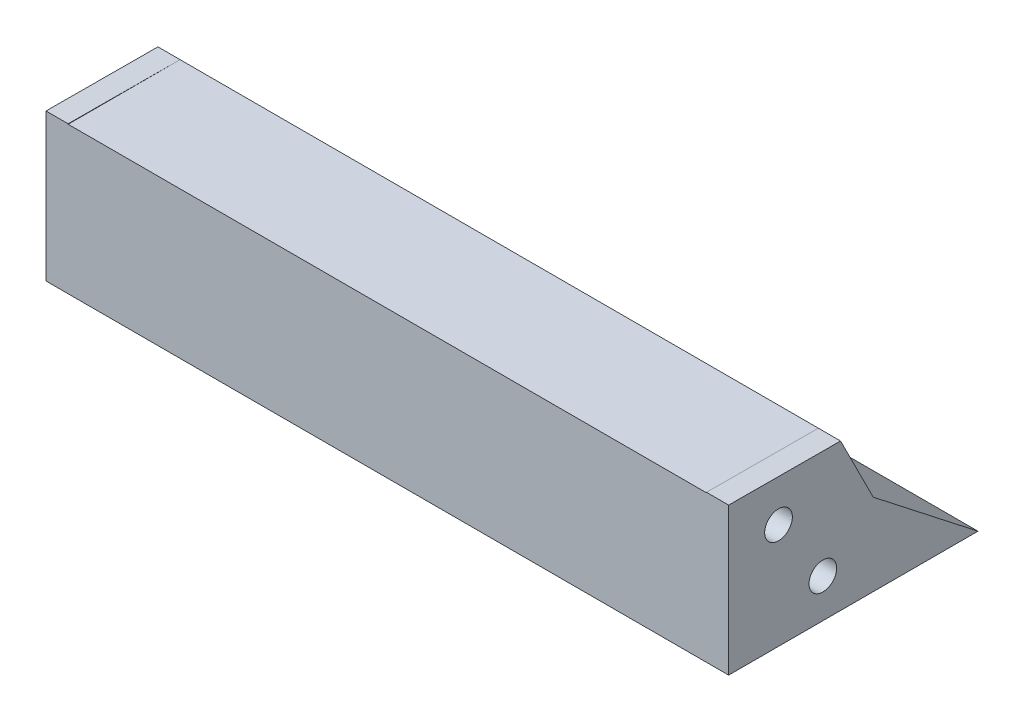
ISO-10303-21;
HEADER;
FILE_DESCRIPTION(('STEP AP214'),'2;1');
FILE_NAME('part.step','',(''),(''),'','','');
FILE_SCHEMA(('AUTOMOTIVE_DESIGN { 1 0 10303 214 1 1 1 1 }'));
ENDSEC;
DATA;
#1=APPLICATION_CONTEXT('core data for automotive mechanical design processes');
#2=APPLICATION_PROTOCOL_DEFINITION('international standard','automotive_design',2000,#1);
#3=PRODUCT_CONTEXT('',#1,'mechanical');
#4=PRODUCT('Part','Part','',(#3));
#5=PRODUCT_RELATED_PRODUCT_CATEGORY('part','',(#4));
#6=PRODUCT_DEFINITION_FORMATION('','',#4);
#7=PRODUCT_DEFINITION_CONTEXT('part definition',#1,'design');
#8=PRODUCT_DEFINITION('design','',#6,#7);
#9=PRODUCT_DEFINITION_SHAPE('','',#8);
#10=(LENGTH_UNIT() NAMED_UNIT(*) SI_UNIT(.MILLI.,.METRE.));
#11=(NAMED_UNIT(*) PLANE_ANGLE_UNIT() SI_UNIT($,.RADIAN.));
#12=(NAMED_UNIT(*) SI_UNIT($,.STERADIAN.) SOLID_ANGLE_UNIT());
#13=UNCERTAINTY_MEASURE_WITH_UNIT(LENGTH_MEASURE(1.E-05),#10,'distance_accuracy_value','');
#14=(GEOMETRIC_REPRESENTATION_CONTEXT(3) GLOBAL_UNCERTAINTY_ASSIGNED_CONTEXT((#13)) GLOBAL_UNIT_ASSIGNED_CONTEXT((#10,
#11,#12)) REPRESENTATION_CONTEXT('',''));
#15=CARTESIAN_POINT('',(0.,0.,0.));
#16=DIRECTION('',(0.,0.,1.));
#17=DIRECTION('',(1.,0.,0.));
#18=AXIS2_PLACEMENT_3D('',#15,#16,#17);
#19=CARTESIAN_POINT('',(31.3,-7.71124143049908,1.45));
#20=DIRECTION('',(0.,0.,-1.));
#21=DIRECTION('',(0.,1.,0.));
#22=AXIS2_PLACEMENT_3D('',#19,#20,#21);
#23=PLANE('',#22);
#24=DIRECTION('',(0.,-1.,0.));
#25=VECTOR('',#24,1.);
#26=CARTESIAN_POINT('',(30.8,-7.71124143049908,1.45));
#27=LINE('',#26,#25);
#28=CARTESIAN_POINT('',(30.8,-7.71124143049908,1.45000000000044));
#29=VERTEX_POINT('',#28);
#30=CARTESIAN_POINT('',(30.8,-21.,1.45));
#31=VERTEX_POINT('',#30);
#32=EDGE_CURVE('E99',#29,#31,#27,.T.);
#33=ORIENTED_EDGE('',*,*,#32,.F.);
#34=DIRECTION('',(-1.,0.,0.));
#35=VECTOR('',#34,1.);
#36=CARTESIAN_POINT('',(31.3,-7.71124143049908,1.45));
#37=LINE('',#36,#35);
#38=CARTESIAN_POINT('',(28.8,-7.71124143049908,1.45));
#39=VERTEX_POINT('',#38);
#40=EDGE_CURVE('E107',#29,#39,#37,.T.);
#41=ORIENTED_EDGE('',*,*,#40,.T.);
#42=DIRECTION('',(0.,1.,0.));
#43=VECTOR('',#42,1.);
#44=CARTESIAN_POINT('',(28.8,4.25,1.45));
#45=LINE('',#44,#43);
#46=CARTESIAN_POINT('',(28.8,-7.75,1.45));
#47=VERTEX_POINT('',#46);
#48=EDGE_CURVE('E142',#47,#39,#45,.T.);
#49=ORIENTED_EDGE('',*,*,#48,.F.);
#50=DIRECTION('',(1.,0.,0.));
#51=VECTOR('',#50,1.);
#52=CARTESIAN_POINT('',(-28.8,-7.75,1.45));
#53=LINE('',#52,#51);
#54=CARTESIAN_POINT('',(-28.8,-7.75,1.45));
#55=VERTEX_POINT('',#54);
#56=EDGE_CURVE('E129',#55,#47,#53,.T.);
#57=ORIENTED_EDGE('',*,*,#56,.F.);
#58=DIRECTION('',(0.,-1.,0.));
#59=VECTOR('',#58,1.);
#60=CARTESIAN_POINT('',(-28.8,4.25,1.45));
#61=LINE('',#60,#59);
#62=CARTESIAN_POINT('',(-28.8,-7.71124143049908,1.45));
#63=VERTEX_POINT('',#62);
#64=EDGE_CURVE('E138',#63,#55,#61,.T.);
#65=ORIENTED_EDGE('',*,*,#64,.F.);
#66=CARTESIAN_POINT('',(-30.8,-7.71124143049908,1.45));
#67=VERTEX_POINT('',#66);
#68=EDGE_CURVE('E118',#63,#67,#37,.T.);
#69=ORIENTED_EDGE('',*,*,#68,.T.);
#70=DIRECTION('',(0.,1.,0.));
#71=VECTOR('',#70,1.);
#72=CARTESIAN_POINT('',(-30.8,-7.71124143049908,1.45));
#73=LINE('',#72,#71);
#74=CARTESIAN_POINT('',(-30.8,-21.,1.45));
#75=VERTEX_POINT('',#74);
#76=EDGE_CURVE('E58',#75,#67,#73,.T.);
#77=ORIENTED_EDGE('',*,*,#76,.F.);
#78=DIRECTION('',(-1.,0.,0.));
#79=VECTOR('',#78,1.);
#80=CARTESIAN_POINT('',(31.3,-21.,1.45));
#81=LINE('',#80,#79);
#82=EDGE_CURVE('E110',#31,#75,#81,.T.);
#83=ORIENTED_EDGE('',*,*,#82,.F.);
#84=EDGE_LOOP('',(#33,#41,#49,#57,#65,#69,#77,#83));
#85=FACE_BOUND('',#84,.T.);
#86=ADVANCED_FACE('F37',(#85),#23,.F.);
#87=CARTESIAN_POINT('',(31.3,-21.,1.45));
#88=DIRECTION('',(0.,1.,0.));
#89=DIRECTION('',(0.,0.,1.));
#90=AXIS2_PLACEMENT_3D('',#87,#88,#89);
#91=PLANE('',#90);
#92=DIRECTION('',(0.,0.,-1.));
#93=VECTOR('',#92,1.);
#94=CARTESIAN_POINT('',(30.8,-21.,25.05));
#95=LINE('',#94,#93);
#96=CARTESIAN_POINT('',(30.8,-21.,-21.05));
#97=VERTEX_POINT('',#96);
#98=EDGE_CURVE('E159',#31,#97,#95,.T.);
#99=ORIENTED_EDGE('',*,*,#98,.F.);
#100=ORIENTED_EDGE('',*,*,#82,.T.);
#101=DIRECTION('',(0.,0.,1.));
#102=VECTOR('',#101,1.);
#103=CARTESIAN_POINT('',(-30.8,-21.,25.05));
#104=LINE('',#103,#102);
#105=CARTESIAN_POINT('',(-30.8,-21.,-21.05));
#106=VERTEX_POINT('',#105);
#107=EDGE_CURVE('E157',#106,#75,#104,.T.);
#108=ORIENTED_EDGE('',*,*,#107,.F.);
#109=DIRECTION('',(-1.,0.,0.));
#110=VECTOR('',#109,1.);
#111=CARTESIAN_POINT('',(31.3,-21.,-21.05));
#112=LINE('',#111,#110);
#113=EDGE_CURVE('E123',#97,#106,#112,.T.);
#114=ORIENTED_EDGE('',*,*,#113,.F.);
#115=EDGE_LOOP('',(#99,#100,#108,#114));
#116=FACE_BOUND('',#115,.T.);
#117=ADVANCED_FACE('F218',(#116),#91,.F.);
#118=CARTESIAN_POINT('',(31.3,-21.,-21.05));
#119=DIRECTION('',(0.,-0.788010753606726,0.615661475325653));
#120=DIRECTION('',(0.,-0.615661475325653,-0.788010753606726));
#121=AXIS2_PLACEMENT_3D('',#118,#119,#120);
#122=PLANE('',#121);
#123=DIRECTION('',(0.,0.615661475325653,0.788010753606726));
#124=VECTOR('',#123,1.);
#125=CARTESIAN_POINT('',(30.8,-21.,-21.05));
#126=LINE('',#125,#124);
#127=CARTESIAN_POINT('',(30.8,-13.6120622960922,-11.5938709567193));
#128=VERTEX_POINT('',#127);
#129=EDGE_CURVE('E112',#97,#128,#126,.T.);
#130=ORIENTED_EDGE('',*,*,#129,.F.);
#131=ORIENTED_EDGE('',*,*,#113,.T.);
#132=DIRECTION('',(0.,-0.615661475325653,-0.788010753606726));
#133=VECTOR('',#132,1.);
#134=CARTESIAN_POINT('',(-30.8,-21.,-21.05));
#135=LINE('',#134,#133);
#136=CARTESIAN_POINT('',(-30.8,-13.6120622960922,-11.5938709567193));
#137=VERTEX_POINT('',#136);
#138=EDGE_CURVE('E153',#137,#106,#135,.T.);
#139=ORIENTED_EDGE('',*,*,#138,.F.);
#140=DIRECTION('',(-1.,0.,0.));
#141=VECTOR('',#140,1.);
#142=CARTESIAN_POINT('',(31.3,-13.6120622960922,-11.5938709567193));
#143=LINE('',#142,#141);
#144=EDGE_CURVE('E126',#128,#137,#143,.T.);
#145=ORIENTED_EDGE('',*,*,#144,.F.);
#146=EDGE_LOOP('',(#130,#131,#139,#145));
#147=FACE_BOUND('',#146,.T.);
#148=ADVANCED_FACE('F222',(#147),#122,.F.);
#149=CARTESIAN_POINT('',(31.3,-13.6120622960922,-11.5938709567193));
#150=DIRECTION('',(0.,-0.448880429707347,0.893591830661934));
#151=DIRECTION('',(0.,-0.893591830661935,-0.448880429707347));
#152=AXIS2_PLACEMENT_3D('',#149,#150,#151);
#153=PLANE('',#152);
#154=DIRECTION('',(0.,0.893591830661935,0.448880429707347));
#155=VECTOR('',#154,1.);
#156=CARTESIAN_POINT('',(30.8,-13.6120622960922,-11.5938709567193));
#157=LINE('',#156,#155);
#158=CARTESIAN_POINT('',(30.8,-7.75,-8.64916516135422));
#159=VERTEX_POINT('',#158);
#160=EDGE_CURVE('E50',#128,#159,#157,.T.);
#161=ORIENTED_EDGE('',*,*,#160,.F.);
#162=ORIENTED_EDGE('',*,*,#144,.T.);
#163=DIRECTION('',(0.,-0.893591830661935,-0.448880429707347));
#164=VECTOR('',#163,1.);
#165=CARTESIAN_POINT('',(-30.8,-13.6120622960922,-11.5938709567193));
#166=LINE('',#165,#164);
#167=CARTESIAN_POINT('',(-30.8,-7.75,-8.64916516135422));
#168=VERTEX_POINT('',#167);
#169=EDGE_CURVE('E155',#168,#137,#166,.T.);
#170=ORIENTED_EDGE('',*,*,#169,.F.);
#171=DIRECTION('',(1.,0.,0.));
#172=VECTOR('',#171,1.);
#173=CARTESIAN_POINT('',(-31.3,-7.75,-8.64916516135422));
#174=LINE('',#173,#172);
#175=CARTESIAN_POINT('',(-28.8,-7.75,-8.64916516135422));
#176=VERTEX_POINT('',#175);
#177=EDGE_CURVE('E148',#168,#176,#174,.T.);
#178=ORIENTED_EDGE('',*,*,#177,.T.);
#179=DIRECTION('',(-1.,0.,0.));
#180=VECTOR('',#179,1.);
#181=CARTESIAN_POINT('',(-28.8,-7.75,-8.64916516135422));
#182=LINE('',#181,#180);
#183=CARTESIAN_POINT('',(28.8,-7.75,-8.64916516135422));
#184=VERTEX_POINT('',#183);
#185=EDGE_CURVE('E131',#184,#176,#182,.T.);
#186=ORIENTED_EDGE('',*,*,#185,.F.);
#187=EDGE_CURVE('E111',#184,#159,#174,.T.);
#188=ORIENTED_EDGE('',*,*,#187,.T.);
#189=EDGE_LOOP('',(#161,#162,#170,#178,#186,#188));
#190=FACE_BOUND('',#189,.T.);
#191=ADVANCED_FACE('F227',(#190),#153,.F.);
#192=CARTESIAN_POINT('',(-31.3,-7.71124143049908,1.45));
#193=DIRECTION('',(0.,-0.999992635729421,0.00383777108831159));
#194=DIRECTION('',(0.,-0.00383777108831159,-0.999992635729421));
#195=AXIS2_PLACEMENT_3D('',#192,#193,#194);
#196=PLANE('',#195);
#197=DIRECTION('',(0.,0.00383777108831159,0.999992635729421));
#198=VECTOR('',#197,1.);
#199=CARTESIAN_POINT('',(30.8,-7.71124143049908,1.45));
#200=LINE('',#199,#198);
#201=EDGE_CURVE('E11',#159,#29,#200,.T.);
#202=ORIENTED_EDGE('',*,*,#201,.F.);
#203=ORIENTED_EDGE('',*,*,#187,.F.);
#204=DIRECTION('',(0.,-0.00383777108831159,-0.999992635729421));
#205=VECTOR('',#204,1.);
#206=CARTESIAN_POINT('',(28.8,-7.79741831083723,-21.0047644258266));
#207=LINE('',#206,#205);
#208=EDGE_CURVE('E116',#39,#184,#207,.T.);
#209=ORIENTED_EDGE('',*,*,#208,.F.);
#210=ORIENTED_EDGE('',*,*,#40,.F.);
#211=EDGE_LOOP('',(#202,#203,#209,#210));
#212=FACE_BOUND('',#211,.T.);
#213=ADVANCED_FACE('F114',(#212),#196,.F.);
#214=DIRECTION('',(0.,-0.00383777108831159,-0.999992635729421));
#215=VECTOR('',#214,1.);
#216=CARTESIAN_POINT('',(-30.8,-7.71124143049908,1.45));
#217=LINE('',#216,#215);
#218=EDGE_CURVE('E44',#67,#168,#217,.T.);
#219=ORIENTED_EDGE('',*,*,#218,.F.);
#220=ORIENTED_EDGE('',*,*,#68,.F.);
#221=DIRECTION('',(0.,0.00383777108831159,0.999992635729421));
#222=VECTOR('',#221,1.);
#223=CARTESIAN_POINT('',(-28.8,-7.79741831083723,-21.0047644258266));
#224=LINE('',#223,#222);
#225=EDGE_CURVE('E144',#176,#63,#224,.T.);
#226=ORIENTED_EDGE('',*,*,#225,.F.);
#227=ORIENTED_EDGE('',*,*,#177,.F.);
#228=EDGE_LOOP('',(#219,#220,#226,#227));
#229=FACE_BOUND('',#228,.T.);
#230=ADVANCED_FACE('F238',(#229),#196,.F.);
#231=CARTESIAN_POINT('',(-28.8,4.25,-21.051));
#232=DIRECTION('',(-1.,0.,0.));
#233=DIRECTION('',(0.,-1.,0.));
#234=AXIS2_PLACEMENT_3D('',#231,#232,#233);
#235=PLANE('',#234);
#236=DIRECTION('',(0.,0.,1.));
#237=VECTOR('',#236,1.);
#238=CARTESIAN_POINT('',(-28.8,-7.75,-21.051));
#239=LINE('',#238,#237);
#240=EDGE_CURVE('E135',#176,#55,#239,.T.);
#241=ORIENTED_EDGE('',*,*,#240,.F.);
#242=ORIENTED_EDGE('',*,*,#225,.T.);
#243=ORIENTED_EDGE('',*,*,#64,.T.);
#244=EDGE_LOOP('',(#241,#242,#243));
#245=FACE_BOUND('',#244,.T.);
#246=ADVANCED_FACE('F234',(#245),#235,.F.);
#247=CARTESIAN_POINT('',(28.8,4.25,-21.051));
#248=DIRECTION('',(1.,0.,0.));
#249=DIRECTION('',(0.,0.,-1.));
#250=AXIS2_PLACEMENT_3D('',#247,#248,#249);
#251=PLANE('',#250);
#252=ORIENTED_EDGE('',*,*,#48,.T.);
#253=ORIENTED_EDGE('',*,*,#208,.T.);
#254=DIRECTION('',(0.,0.,1.));
#255=VECTOR('',#254,1.);
#256=CARTESIAN_POINT('',(28.8,-7.75,-21.051));
#257=LINE('',#256,#255);
#258=EDGE_CURVE('E134',#184,#47,#257,.T.);
#259=ORIENTED_EDGE('',*,*,#258,.T.);
#260=EDGE_LOOP('',(#252,#253,#259));
#261=FACE_BOUND('',#260,.T.);
#262=ADVANCED_FACE('F237',(#261),#251,.F.);
#263=CARTESIAN_POINT('',(-28.8,-7.75,-21.051));
#264=DIRECTION('',(0.,-1.,0.));
#265=DIRECTION('',(0.,0.,-1.));
#266=AXIS2_PLACEMENT_3D('',#263,#264,#265);
#267=PLANE('',#266);
#268=ORIENTED_EDGE('',*,*,#56,.T.);
#269=ORIENTED_EDGE('',*,*,#258,.F.);
#270=ORIENTED_EDGE('',*,*,#185,.T.);
#271=ORIENTED_EDGE('',*,*,#240,.T.);
#272=EDGE_LOOP('',(#268,#269,#270,#271));
#273=FACE_BOUND('',#272,.T.);
#274=ADVANCED_FACE('F198',(#273),#267,.F.);
#275=CARTESIAN_POINT('',(-30.8,-21.,25.05));
#276=DIRECTION('',(-1.,0.,0.));
#277=DIRECTION('',(0.,-1.,0.));
#278=AXIS2_PLACEMENT_3D('',#275,#276,#277);
#279=PLANE('',#278);
#280=CARTESIAN_POINT('',(-30.8,-17.5000000000001,-7.05));
#281=DIRECTION('',(-1.,0.,0.));
#282=DIRECTION('',(0.,-1.,0.));
#283=AXIS2_PLACEMENT_3D('',#280,#281,#282);
#284=CIRCLE('',#283,1.2500000000006);
#285=CARTESIAN_POINT('',(-30.8,-18.7500000000007,-7.05));
#286=VERTEX_POINT('',#285);
#287=EDGE_CURVE('E180',#286,#286,#284,.T.);
#288=ORIENTED_EDGE('',*,*,#287,.F.);
#289=EDGE_LOOP('',(#288));
#290=FACE_BOUND('',#289,.T.);
#291=CARTESIAN_POINT('',(-30.8,-11.5000000000001,-3.05));
#292=DIRECTION('',(-1.,0.,0.));
#293=DIRECTION('',(0.,-1.,0.));
#294=AXIS2_PLACEMENT_3D('',#291,#292,#293);
#295=CIRCLE('',#294,1.2500000000006);
#296=CARTESIAN_POINT('',(-30.8,-12.7500000000007,-3.05));
#297=VERTEX_POINT('',#296);
#298=EDGE_CURVE('E174',#297,#297,#295,.T.);
#299=ORIENTED_EDGE('',*,*,#298,.F.);
#300=EDGE_LOOP('',(#299));
#301=FACE_BOUND('',#300,.T.);
#302=ORIENTED_EDGE('',*,*,#76,.T.);
#303=ORIENTED_EDGE('',*,*,#218,.T.);
#304=ORIENTED_EDGE('',*,*,#169,.T.);
#305=ORIENTED_EDGE('',*,*,#138,.T.);
#306=ORIENTED_EDGE('',*,*,#107,.T.);
#307=EDGE_LOOP('',(#302,#303,#304,#305,#306));
#308=FACE_BOUND('',#307,.T.);
#309=ADVANCED_FACE('F195',(#290,#301,#308),#279,.T.);
#310=CARTESIAN_POINT('',(30.8,-21.,25.05));
#311=DIRECTION('',(1.,0.,0.));
#312=DIRECTION('',(0.,1.,0.));
#313=AXIS2_PLACEMENT_3D('',#310,#311,#312);
#314=PLANE('',#313);
#315=CARTESIAN_POINT('',(30.8,-11.5000000000006,-3.04999999999952));
#316=DIRECTION('',(1.,0.,0.));
#317=DIRECTION('',(0.,1.,0.));
#318=AXIS2_PLACEMENT_3D('',#315,#316,#317);
#319=CIRCLE('',#318,1.2500000000006);
#320=CARTESIAN_POINT('',(30.8,-10.25,-3.04999999999952));
#321=VERTEX_POINT('',#320);
#322=EDGE_CURVE('E169',#321,#321,#319,.T.);
#323=ORIENTED_EDGE('',*,*,#322,.F.);
#324=EDGE_LOOP('',(#323));
#325=FACE_BOUND('',#324,.T.);
#326=CARTESIAN_POINT('',(30.8,-17.5000000000006,-7.04999999999952));
#327=DIRECTION('',(1.,0.,0.));
#328=DIRECTION('',(0.,1.,0.));
#329=AXIS2_PLACEMENT_3D('',#326,#327,#328);
#330=CIRCLE('',#329,1.2500000000006);
#331=CARTESIAN_POINT('',(30.8,-16.25,-7.04999999999952));
#332=VERTEX_POINT('',#331);
#333=EDGE_CURVE('E162',#332,#332,#330,.T.);
#334=ORIENTED_EDGE('',*,*,#333,.F.);
#335=EDGE_LOOP('',(#334));
#336=FACE_BOUND('',#335,.T.);
#337=ORIENTED_EDGE('',*,*,#32,.T.);
#338=ORIENTED_EDGE('',*,*,#98,.T.);
#339=ORIENTED_EDGE('',*,*,#129,.T.);
#340=ORIENTED_EDGE('',*,*,#160,.T.);
#341=ORIENTED_EDGE('',*,*,#201,.T.);
#342=EDGE_LOOP('',(#337,#338,#339,#340,#341));
#343=FACE_BOUND('',#342,.T.);
#344=ADVANCED_FACE('F98',(#325,#336,#343),#314,.T.);
#345=CARTESIAN_POINT('',(18.8,-17.5000000000006,-7.04999999999952));
#346=DIRECTION('',(1.,0.,0.));
#347=DIRECTION('',(0.,1.,0.));
#348=AXIS2_PLACEMENT_3D('',#345,#346,#347);
#349=CYLINDRICAL_SURFACE('',#348,1.2500000000006);
#350=CARTESIAN_POINT('',(18.8,-17.5000000000006,-7.04999999999952));
#351=DIRECTION('',(1.,0.,0.));
#352=DIRECTION('',(0.,1.,0.));
#353=AXIS2_PLACEMENT_3D('',#350,#351,#352);
#354=CIRCLE('',#353,1.2500000000006);
#355=CARTESIAN_POINT('',(18.8,-16.25,-7.04999999999952));
#356=VERTEX_POINT('',#355);
#357=EDGE_CURVE('E165',#356,#356,#354,.T.);
#358=ORIENTED_EDGE('',*,*,#357,.F.);
#359=EDGE_LOOP('',(#358));
#360=FACE_BOUND('',#359,.T.);
#361=ORIENTED_EDGE('',*,*,#333,.T.);
#362=EDGE_LOOP('',(#361));
#363=FACE_BOUND('',#362,.T.);
#364=ADVANCED_FACE('F249',(#360,#363),#349,.F.);
#365=CARTESIAN_POINT('',(18.8,-17.5000000000006,-7.04999999999952));
#366=DIRECTION('',(1.,0.,0.));
#367=DIRECTION('',(0.,1.,0.));
#368=AXIS2_PLACEMENT_3D('',#365,#366,#367);
#369=PLANE('',#368);
#370=ORIENTED_EDGE('',*,*,#357,.T.);
#371=EDGE_LOOP('',(#370));
#372=FACE_BOUND('',#371,.T.);
#373=ADVANCED_FACE('F254',(#372),#369,.T.);
#374=CARTESIAN_POINT('',(18.8,-11.5000000000006,-3.04999999999952));
#375=DIRECTION('',(1.,0.,0.));
#376=DIRECTION('',(0.,1.,0.));
#377=AXIS2_PLACEMENT_3D('',#374,#375,#376);
#378=CYLINDRICAL_SURFACE('',#377,1.2500000000006);
#379=CARTESIAN_POINT('',(18.8,-11.5000000000006,-3.04999999999952));
#380=DIRECTION('',(1.,0.,0.));
#381=DIRECTION('',(0.,1.,0.));
#382=AXIS2_PLACEMENT_3D('',#379,#380,#381);
#383=CIRCLE('',#382,1.2500000000006);
#384=CARTESIAN_POINT('',(18.8,-10.25,-3.04999999999952));
#385=VERTEX_POINT('',#384);
#386=EDGE_CURVE('E161',#385,#385,#383,.T.);
#387=ORIENTED_EDGE('',*,*,#386,.F.);
#388=EDGE_LOOP('',(#387));
#389=FACE_BOUND('',#388,.T.);
#390=ORIENTED_EDGE('',*,*,#322,.T.);
#391=EDGE_LOOP('',(#390));
#392=FACE_BOUND('',#391,.T.);
#393=ADVANCED_FACE('F213',(#389,#392),#378,.F.);
#394=CARTESIAN_POINT('',(18.8,-11.5000000000006,-3.04999999999952));
#395=DIRECTION('',(1.,0.,0.));
#396=DIRECTION('',(0.,1.,0.));
#397=AXIS2_PLACEMENT_3D('',#394,#395,#396);
#398=PLANE('',#397);
#399=ORIENTED_EDGE('',*,*,#386,.T.);
#400=EDGE_LOOP('',(#399));
#401=FACE_BOUND('',#400,.T.);
#402=ADVANCED_FACE('F204',(#401),#398,.T.);
#403=CARTESIAN_POINT('',(-18.8,-11.5000000000001,-3.05));
#404=DIRECTION('',(-1.,0.,0.));
#405=DIRECTION('',(0.,-1.,0.));
#406=AXIS2_PLACEMENT_3D('',#403,#404,#405);
#407=CYLINDRICAL_SURFACE('',#406,1.2500000000006);
#408=CARTESIAN_POINT('',(-18.8,-11.5000000000001,-3.05));
#409=DIRECTION('',(-1.,0.,0.));
#410=DIRECTION('',(0.,-1.,0.));
#411=AXIS2_PLACEMENT_3D('',#408,#409,#410);
#412=CIRCLE('',#411,1.2500000000006);
#413=CARTESIAN_POINT('',(-18.8,-12.7500000000007,-3.05));
#414=VERTEX_POINT('',#413);
#415=EDGE_CURVE('E177',#414,#414,#412,.T.);
#416=ORIENTED_EDGE('',*,*,#415,.F.);
#417=EDGE_LOOP('',(#416));
#418=FACE_BOUND('',#417,.T.);
#419=ORIENTED_EDGE('',*,*,#298,.T.);
#420=EDGE_LOOP('',(#419));
#421=FACE_BOUND('',#420,.T.);
#422=ADVANCED_FACE('F202',(#418,#421),#407,.F.);
#423=CARTESIAN_POINT('',(-18.8,-11.5000000000001,-3.05));
#424=DIRECTION('',(-1.,0.,0.));
#425=DIRECTION('',(0.,-1.,0.));
#426=AXIS2_PLACEMENT_3D('',#423,#424,#425);
#427=PLANE('',#426);
#428=ORIENTED_EDGE('',*,*,#415,.T.);
#429=EDGE_LOOP('',(#428));
#430=FACE_BOUND('',#429,.T.);
#431=ADVANCED_FACE('F191',(#430),#427,.T.);
#432=CARTESIAN_POINT('',(-18.8,-17.5000000000001,-7.05));
#433=DIRECTION('',(-1.,0.,0.));
#434=DIRECTION('',(0.,-1.,0.));
#435=AXIS2_PLACEMENT_3D('',#432,#433,#434);
#436=CYLINDRICAL_SURFACE('',#435,1.2500000000006);
#437=CARTESIAN_POINT('',(-18.8,-17.5000000000001,-7.05));
#438=DIRECTION('',(-1.,0.,0.));
#439=DIRECTION('',(0.,-1.,0.));
#440=AXIS2_PLACEMENT_3D('',#437,#438,#439);
#441=CIRCLE('',#440,1.2500000000006);
#442=CARTESIAN_POINT('',(-18.8,-18.7500000000007,-7.05));
#443=VERTEX_POINT('',#442);
#444=EDGE_CURVE('E166',#443,#443,#441,.T.);
#445=ORIENTED_EDGE('',*,*,#444,.F.);
#446=EDGE_LOOP('',(#445));
#447=FACE_BOUND('',#446,.T.);
#448=ORIENTED_EDGE('',*,*,#287,.T.);
#449=EDGE_LOOP('',(#448));
#450=FACE_BOUND('',#449,.T.);
#451=ADVANCED_FACE('F188',(#447,#450),#436,.F.);
#452=CARTESIAN_POINT('',(-18.8,-17.5000000000001,-7.05));
#453=DIRECTION('',(-1.,0.,0.));
#454=DIRECTION('',(0.,-1.,0.));
#455=AXIS2_PLACEMENT_3D('',#452,#453,#454);
#456=PLANE('',#455);
#457=ORIENTED_EDGE('',*,*,#444,.T.);
#458=EDGE_LOOP('',(#457));
#459=FACE_BOUND('',#458,.T.);
#460=ADVANCED_FACE('F186',(#459),#456,.T.);
#461=CLOSED_SHELL('',(#86,#117,#148,#191,#213,#230,#246,#262,#274,#309,#344,#364,#373,#393,#402,
#422,#431,#451,#460));
#462=MANIFOLD_SOLID_BREP('B2',#461);
#463=ADVANCED_BREP_SHAPE_REPRESENTATION('',(#18,#462),#14);
#464=SHAPE_DEFINITION_REPRESENTATION(#9,#463);
ENDSEC;
END-ISO-10303-21;
